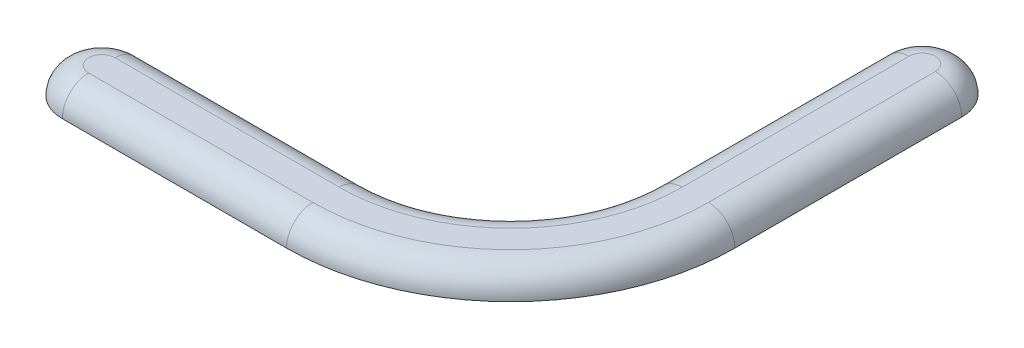
ISO-10303-21;
HEADER;
FILE_DESCRIPTION(('STEP AP214'),'2;1');
FILE_NAME('part.step','',(''),(''),'','','');
FILE_SCHEMA(('AUTOMOTIVE_DESIGN { 1 0 10303 214 1 1 1 1 }'));
ENDSEC;
DATA;
#1=APPLICATION_CONTEXT('core data for automotive mechanical design processes');
#2=APPLICATION_PROTOCOL_DEFINITION('international standard','automotive_design',2000,#1);
#3=PRODUCT_CONTEXT('',#1,'mechanical');
#4=PRODUCT('Part','Part','',(#3));
#5=PRODUCT_RELATED_PRODUCT_CATEGORY('part','',(#4));
#6=PRODUCT_DEFINITION_FORMATION('','',#4);
#7=PRODUCT_DEFINITION_CONTEXT('part definition',#1,'design');
#8=PRODUCT_DEFINITION('design','',#6,#7);
#9=PRODUCT_DEFINITION_SHAPE('','',#8);
#10=(LENGTH_UNIT() NAMED_UNIT(*) SI_UNIT(.MILLI.,.METRE.));
#11=(NAMED_UNIT(*) PLANE_ANGLE_UNIT() SI_UNIT($,.RADIAN.));
#12=(NAMED_UNIT(*) SI_UNIT($,.STERADIAN.) SOLID_ANGLE_UNIT());
#13=UNCERTAINTY_MEASURE_WITH_UNIT(LENGTH_MEASURE(1.E-05),#10,'distance_accuracy_value','');
#14=(GEOMETRIC_REPRESENTATION_CONTEXT(3) GLOBAL_UNCERTAINTY_ASSIGNED_CONTEXT((#13)) GLOBAL_UNIT_ASSIGNED_CONTEXT((#10,
#11,#12)) REPRESENTATION_CONTEXT('',''));
#15=CARTESIAN_POINT('',(0.,0.,0.));
#16=DIRECTION('',(0.,0.,1.));
#17=DIRECTION('',(1.,0.,0.));
#18=AXIS2_PLACEMENT_3D('',#15,#16,#17);
#19=CARTESIAN_POINT('',(37.0063979542959,1.05614812313521,98.896253755));
#20=DIRECTION('',(0.,-1.,0.));
#21=DIRECTION('',(0.,0.,-1.));
#22=AXIS2_PLACEMENT_3D('',#19,#20,#21);
#23=PLANE('',#22);
#24=CARTESIAN_POINT('',(41.2063979542959,1.05614812313521,93.7367562249847));
#25=DIRECTION('',(0.,-1.,0.));
#26=DIRECTION('',(0.,0.,-1.));
#27=AXIS2_PLACEMENT_3D('',#24,#25,#26);
#28=CIRCLE('',#27,0.300000000000002);
#29=CARTESIAN_POINT('',(41.5063979542959,1.05614812313521,93.7367562249847));
#30=VERTEX_POINT('',#29);
#31=CARTESIAN_POINT('',(40.9063979542959,1.05614812313521,93.7367562249847));
#32=VERTEX_POINT('',#31);
#33=EDGE_CURVE('E46',#30,#32,#28,.F.);
#34=ORIENTED_EDGE('',*,*,#33,.T.);
#35=DIRECTION('',(0.,0.,1.));
#36=VECTOR('',#35,1.);
#37=CARTESIAN_POINT('',(40.9063979542959,1.05614812313521,98.896253755));
#38=LINE('',#37,#36);
#39=CARTESIAN_POINT('',(40.9063979542959,1.05614812313521,98.896253755));
#40=VERTEX_POINT('',#39);
#41=EDGE_CURVE('E11',#32,#40,#38,.T.);
#42=ORIENTED_EDGE('',*,*,#41,.T.);
#43=CARTESIAN_POINT('',(37.0063979542959,1.05614812313521,98.896253755));
#44=DIRECTION('',(0.,-1.,0.));
#45=DIRECTION('',(0.,0.,-1.));
#46=AXIS2_PLACEMENT_3D('',#43,#44,#45);
#47=CIRCLE('',#46,3.9);
#48=CARTESIAN_POINT('',(37.0063979542959,1.05614812313521,102.796253755));
#49=VERTEX_POINT('',#48);
#50=EDGE_CURVE('E141',#40,#49,#47,.T.);
#51=ORIENTED_EDGE('',*,*,#50,.T.);
#52=DIRECTION('',(-1.,0.,0.));
#53=VECTOR('',#52,1.);
#54=CARTESIAN_POINT('',(37.0063979542959,1.05614812313521,102.796253755));
#55=LINE('',#54,#53);
#56=CARTESIAN_POINT('',(31.9063979542959,1.05614812313521,102.796253755));
#57=VERTEX_POINT('',#56);
#58=EDGE_CURVE('E146',#49,#57,#55,.T.);
#59=ORIENTED_EDGE('',*,*,#58,.T.);
#60=CARTESIAN_POINT('',(31.9063979542959,1.05614812313521,103.096253755));
#61=DIRECTION('',(0.,-1.,0.));
#62=DIRECTION('',(0.,0.,-1.));
#63=AXIS2_PLACEMENT_3D('',#60,#61,#62);
#64=CIRCLE('',#63,0.299999999999998);
#65=CARTESIAN_POINT('',(31.9063979542959,1.05614812313521,103.396253755));
#66=VERTEX_POINT('',#65);
#67=EDGE_CURVE('E148',#57,#66,#64,.F.);
#68=ORIENTED_EDGE('',*,*,#67,.T.);
#69=DIRECTION('',(1.,0.,0.));
#70=VECTOR('',#69,1.);
#71=CARTESIAN_POINT('',(37.0063979542959,1.05614812313521,103.396253755));
#72=LINE('',#71,#70);
#73=CARTESIAN_POINT('',(37.0063979542959,1.05614812313521,103.396253755));
#74=VERTEX_POINT('',#73);
#75=EDGE_CURVE('E150',#66,#74,#72,.T.);
#76=ORIENTED_EDGE('',*,*,#75,.T.);
#77=CARTESIAN_POINT('',(37.0063979542959,1.05614812313521,98.896253755));
#78=DIRECTION('',(0.,-1.,0.));
#79=DIRECTION('',(0.,0.,-1.));
#80=AXIS2_PLACEMENT_3D('',#77,#78,#79);
#81=CIRCLE('',#80,4.5);
#82=CARTESIAN_POINT('',(41.5063979542959,1.05614812313521,98.896253755));
#83=VERTEX_POINT('',#82);
#84=EDGE_CURVE('E144',#74,#83,#81,.F.);
#85=ORIENTED_EDGE('',*,*,#84,.T.);
#86=DIRECTION('',(0.,0.,-1.));
#87=VECTOR('',#86,1.);
#88=CARTESIAN_POINT('',(41.5063979542959,1.05614812313521,98.896253755));
#89=LINE('',#88,#87);
#90=EDGE_CURVE('E121',#83,#30,#89,.T.);
#91=ORIENTED_EDGE('',*,*,#90,.T.);
#92=EDGE_LOOP('',(#34,#42,#51,#59,#68,#76,#85,#91));
#93=FACE_BOUND('',#92,.T.);
#94=ADVANCED_FACE('F37',(#93),#23,.F.);
#95=CARTESIAN_POINT('',(37.0063979542959,0.456148123135214,98.896253755));
#96=DIRECTION('',(0.,-1.,0.));
#97=DIRECTION('',(0.,0.,-1.));
#98=AXIS2_PLACEMENT_3D('',#95,#96,#97);
#99=PLANE('',#98);
#100=CARTESIAN_POINT('',(37.0063979542959,0.456148123135214,98.896253755));
#101=DIRECTION('',(0.,1.,0.));
#102=DIRECTION('',(0.,0.,-1.));
#103=AXIS2_PLACEMENT_3D('',#100,#101,#102);
#104=CIRCLE('',#103,5.1);
#105=CARTESIAN_POINT('',(37.0063979542959,0.456148123135214,103.996253755));
#106=VERTEX_POINT('',#105);
#107=CARTESIAN_POINT('',(42.1063979542959,0.456148123135214,98.896253755));
#108=VERTEX_POINT('',#107);
#109=EDGE_CURVE('E103',#106,#108,#104,.T.);
#110=ORIENTED_EDGE('',*,*,#109,.F.);
#111=DIRECTION('',(1.,0.,0.));
#112=VECTOR('',#111,1.);
#113=CARTESIAN_POINT('',(31.9063979542959,0.456148123135214,103.996253755));
#114=LINE('',#113,#112);
#115=CARTESIAN_POINT('',(31.9063979542959,0.456148123135214,103.996253755));
#116=VERTEX_POINT('',#115);
#117=EDGE_CURVE('E152',#116,#106,#114,.T.);
#118=ORIENTED_EDGE('',*,*,#117,.F.);
#119=CARTESIAN_POINT('',(31.9063979542959,0.456148123135214,103.096253755));
#120=DIRECTION('',(0.,1.,0.));
#121=DIRECTION('',(0.,0.,-1.));
#122=AXIS2_PLACEMENT_3D('',#119,#120,#121);
#123=CIRCLE('',#122,0.899999999999998);
#124=CARTESIAN_POINT('',(31.9063979542959,0.456148123135214,102.196253755));
#125=VERTEX_POINT('',#124);
#126=EDGE_CURVE('E154',#125,#116,#123,.T.);
#127=ORIENTED_EDGE('',*,*,#126,.F.);
#128=DIRECTION('',(-1.,0.,0.));
#129=VECTOR('',#128,1.);
#130=CARTESIAN_POINT('',(31.9063979542959,0.456148123135214,102.196253755));
#131=LINE('',#130,#129);
#132=CARTESIAN_POINT('',(37.0063979542959,0.456148123135214,102.196253755));
#133=VERTEX_POINT('',#132);
#134=EDGE_CURVE('E157',#133,#125,#131,.T.);
#135=ORIENTED_EDGE('',*,*,#134,.F.);
#136=CARTESIAN_POINT('',(37.0063979542959,0.456148123135214,98.896253755));
#137=DIRECTION('',(0.,-1.,0.));
#138=DIRECTION('',(0.,0.,-1.));
#139=AXIS2_PLACEMENT_3D('',#136,#137,#138);
#140=CIRCLE('',#139,3.3);
#141=CARTESIAN_POINT('',(40.3063979542959,0.456148123135214,98.896253755));
#142=VERTEX_POINT('',#141);
#143=EDGE_CURVE('E160',#142,#133,#140,.T.);
#144=ORIENTED_EDGE('',*,*,#143,.F.);
#145=DIRECTION('',(0.,0.,1.));
#146=VECTOR('',#145,1.);
#147=CARTESIAN_POINT('',(40.3063979542959,0.456148123135214,98.896253755));
#148=LINE('',#147,#146);
#149=CARTESIAN_POINT('',(40.3063979542959,0.456148123135214,93.7367562249847));
#150=VERTEX_POINT('',#149);
#151=EDGE_CURVE('E163',#150,#142,#148,.T.);
#152=ORIENTED_EDGE('',*,*,#151,.F.);
#153=CARTESIAN_POINT('',(41.2063979542959,0.456148123135214,93.7367562249847));
#154=DIRECTION('',(0.,1.,0.));
#155=DIRECTION('',(0.,0.,1.));
#156=AXIS2_PLACEMENT_3D('',#153,#154,#155);
#157=CIRCLE('',#156,0.900000000000001);
#158=CARTESIAN_POINT('',(42.1063979542959,0.456148123135214,93.7367562249847));
#159=VERTEX_POINT('',#158);
#160=EDGE_CURVE('E106',#159,#150,#157,.T.);
#161=ORIENTED_EDGE('',*,*,#160,.F.);
#162=DIRECTION('',(0.,0.,-1.));
#163=VECTOR('',#162,1.);
#164=CARTESIAN_POINT('',(42.1063979542959,0.456148123135214,98.896253755));
#165=LINE('',#164,#163);
#166=EDGE_CURVE('E100',#108,#159,#165,.T.);
#167=ORIENTED_EDGE('',*,*,#166,.F.);
#168=EDGE_LOOP('',(#110,#118,#127,#135,#144,#152,#161,#167));
#169=FACE_BOUND('',#168,.T.);
#170=ADVANCED_FACE('F102',(#169),#99,.T.);
#171=CARTESIAN_POINT('',(37.0063979542959,0.456148123135214,98.896253755));
#172=DIRECTION('',(0.,-1.,0.));
#173=DIRECTION('',(0.,0.,-1.));
#174=AXIS2_PLACEMENT_3D('',#171,#172,#173);
#175=TOROIDAL_SURFACE('',#174,4.5,0.6);
#176=CARTESIAN_POINT('',(37.0063979542959,0.456148123135214,103.396253755));
#177=DIRECTION('',(-1.,0.,0.));
#178=DIRECTION('',(0.,0.,1.));
#179=AXIS2_PLACEMENT_3D('',#176,#177,#178);
#180=CIRCLE('',#179,0.6);
#181=EDGE_CURVE('E117',#106,#74,#180,.T.);
#182=ORIENTED_EDGE('',*,*,#181,.F.);
#183=ORIENTED_EDGE('',*,*,#109,.T.);
#184=CARTESIAN_POINT('',(41.5063979542959,0.456148123135214,98.896253755));
#185=DIRECTION('',(0.,0.,-1.));
#186=DIRECTION('',(-1.,0.,0.));
#187=AXIS2_PLACEMENT_3D('',#184,#185,#186);
#188=CIRCLE('',#187,0.6);
#189=EDGE_CURVE('E41',#83,#108,#188,.T.);
#190=ORIENTED_EDGE('',*,*,#189,.F.);
#191=ORIENTED_EDGE('',*,*,#84,.F.);
#192=EDGE_LOOP('',(#182,#183,#190,#191));
#193=FACE_BOUND('',#192,.T.);
#194=ADVANCED_FACE('F39',(#193),#175,.T.);
#195=CARTESIAN_POINT('',(41.5063979542959,0.456148123135214,98.896253755));
#196=DIRECTION('',(0.,0.,-1.));
#197=DIRECTION('',(-1.,0.,0.));
#198=AXIS2_PLACEMENT_3D('',#195,#196,#197);
#199=CYLINDRICAL_SURFACE('',#198,0.6);
#200=ORIENTED_EDGE('',*,*,#189,.T.);
#201=ORIENTED_EDGE('',*,*,#166,.T.);
#202=CARTESIAN_POINT('',(41.5063979542959,0.456148123135214,93.7367562249847));
#203=DIRECTION('',(0.,0.,-1.));
#204=DIRECTION('',(-1.,0.,0.));
#205=AXIS2_PLACEMENT_3D('',#202,#203,#204);
#206=CIRCLE('',#205,0.6);
#207=EDGE_CURVE('E122',#30,#159,#206,.T.);
#208=ORIENTED_EDGE('',*,*,#207,.F.);
#209=ORIENTED_EDGE('',*,*,#90,.F.);
#210=EDGE_LOOP('',(#200,#201,#208,#209));
#211=FACE_BOUND('',#210,.T.);
#212=ADVANCED_FACE('F120',(#211),#199,.T.);
#213=CARTESIAN_POINT('',(37.0063979542959,0.456148123135214,103.396253755));
#214=DIRECTION('',(1.,0.,0.));
#215=DIRECTION('',(0.,0.,-1.));
#216=AXIS2_PLACEMENT_3D('',#213,#214,#215);
#217=CYLINDRICAL_SURFACE('',#216,0.6);
#218=ORIENTED_EDGE('',*,*,#181,.T.);
#219=ORIENTED_EDGE('',*,*,#75,.F.);
#220=CARTESIAN_POINT('',(31.9063979542959,0.456148123135214,103.396253755));
#221=DIRECTION('',(-1.,0.,0.));
#222=DIRECTION('',(0.,0.,1.));
#223=AXIS2_PLACEMENT_3D('',#220,#221,#222);
#224=CIRCLE('',#223,0.6);
#225=EDGE_CURVE('E125',#116,#66,#224,.T.);
#226=ORIENTED_EDGE('',*,*,#225,.F.);
#227=ORIENTED_EDGE('',*,*,#117,.T.);
#228=EDGE_LOOP('',(#218,#219,#226,#227));
#229=FACE_BOUND('',#228,.T.);
#230=ADVANCED_FACE('F183',(#229),#217,.T.);
#231=CARTESIAN_POINT('',(41.2063979542959,0.456148123135214,93.7367562249847));
#232=DIRECTION('',(0.,-1.,0.));
#233=DIRECTION('',(0.,0.,-1.));
#234=AXIS2_PLACEMENT_3D('',#231,#232,#233);
#235=DEGENERATE_TOROIDAL_SURFACE('',#234,0.300000000000002,0.6,.T.);
#236=ORIENTED_EDGE('',*,*,#207,.T.);
#237=ORIENTED_EDGE('',*,*,#160,.T.);
#238=CARTESIAN_POINT('',(40.9063979542959,0.456148123135214,93.7367562249847));
#239=DIRECTION('',(0.,0.,1.));
#240=DIRECTION('',(1.,0.,0.));
#241=AXIS2_PLACEMENT_3D('',#238,#239,#240);
#242=CIRCLE('',#241,0.6);
#243=EDGE_CURVE('E130',#32,#150,#242,.T.);
#244=ORIENTED_EDGE('',*,*,#243,.F.);
#245=ORIENTED_EDGE('',*,*,#33,.F.);
#246=EDGE_LOOP('',(#236,#237,#244,#245));
#247=FACE_BOUND('',#246,.T.);
#248=ADVANCED_FACE('F167',(#247),#235,.T.);
#249=CARTESIAN_POINT('',(31.9063979542959,0.456148123135214,103.096253755));
#250=DIRECTION('',(0.,-1.,0.));
#251=DIRECTION('',(0.,0.,-1.));
#252=AXIS2_PLACEMENT_3D('',#249,#250,#251);
#253=DEGENERATE_TOROIDAL_SURFACE('',#252,0.299999999999998,0.6,.T.);
#254=ORIENTED_EDGE('',*,*,#225,.T.);
#255=ORIENTED_EDGE('',*,*,#67,.F.);
#256=CARTESIAN_POINT('',(31.9063979542959,0.456148123135214,102.796253755));
#257=DIRECTION('',(1.,0.,0.));
#258=DIRECTION('',(0.,0.,-1.));
#259=AXIS2_PLACEMENT_3D('',#256,#257,#258);
#260=CIRCLE('',#259,0.6);
#261=EDGE_CURVE('E133',#125,#57,#260,.T.);
#262=ORIENTED_EDGE('',*,*,#261,.F.);
#263=ORIENTED_EDGE('',*,*,#126,.T.);
#264=EDGE_LOOP('',(#254,#255,#262,#263));
#265=FACE_BOUND('',#264,.T.);
#266=ADVANCED_FACE('F180',(#265),#253,.T.);
#267=CARTESIAN_POINT('',(40.9063979542959,0.456148123135214,98.896253755));
#268=DIRECTION('',(0.,0.,1.));
#269=DIRECTION('',(1.,0.,0.));
#270=AXIS2_PLACEMENT_3D('',#267,#268,#269);
#271=CYLINDRICAL_SURFACE('',#270,0.6);
#272=ORIENTED_EDGE('',*,*,#243,.T.);
#273=ORIENTED_EDGE('',*,*,#151,.T.);
#274=CARTESIAN_POINT('',(40.9063979542959,0.456148123135214,98.896253755));
#275=DIRECTION('',(0.,0.,1.));
#276=DIRECTION('',(1.,0.,0.));
#277=AXIS2_PLACEMENT_3D('',#274,#275,#276);
#278=CIRCLE('',#277,0.6);
#279=EDGE_CURVE('E136',#40,#142,#278,.T.);
#280=ORIENTED_EDGE('',*,*,#279,.F.);
#281=ORIENTED_EDGE('',*,*,#41,.F.);
#282=EDGE_LOOP('',(#272,#273,#280,#281));
#283=FACE_BOUND('',#282,.T.);
#284=ADVANCED_FACE('F169',(#283),#271,.T.);
#285=CARTESIAN_POINT('',(37.0063979542959,0.456148123135214,102.796253755));
#286=DIRECTION('',(-1.,0.,0.));
#287=DIRECTION('',(0.,0.,1.));
#288=AXIS2_PLACEMENT_3D('',#285,#286,#287);
#289=CYLINDRICAL_SURFACE('',#288,0.6);
#290=ORIENTED_EDGE('',*,*,#261,.T.);
#291=ORIENTED_EDGE('',*,*,#58,.F.);
#292=CARTESIAN_POINT('',(37.0063979542959,0.456148123135214,102.796253755));
#293=DIRECTION('',(1.,0.,0.));
#294=DIRECTION('',(0.,0.,-1.));
#295=AXIS2_PLACEMENT_3D('',#292,#293,#294);
#296=CIRCLE('',#295,0.6);
#297=EDGE_CURVE('E138',#133,#49,#296,.T.);
#298=ORIENTED_EDGE('',*,*,#297,.F.);
#299=ORIENTED_EDGE('',*,*,#134,.T.);
#300=EDGE_LOOP('',(#290,#291,#298,#299));
#301=FACE_BOUND('',#300,.T.);
#302=ADVANCED_FACE('F182',(#301),#289,.T.);
#303=CARTESIAN_POINT('',(37.0063979542959,0.456148123135214,98.896253755));
#304=DIRECTION('',(0.,-1.,0.));
#305=DIRECTION('',(0.,0.,-1.));
#306=AXIS2_PLACEMENT_3D('',#303,#304,#305);
#307=TOROIDAL_SURFACE('',#306,3.9,0.6);
#308=ORIENTED_EDGE('',*,*,#279,.T.);
#309=ORIENTED_EDGE('',*,*,#143,.T.);
#310=ORIENTED_EDGE('',*,*,#297,.T.);
#311=ORIENTED_EDGE('',*,*,#50,.F.);
#312=EDGE_LOOP('',(#308,#309,#310,#311));
#313=FACE_BOUND('',#312,.T.);
#314=ADVANCED_FACE('F173',(#313),#307,.T.);
#315=CLOSED_SHELL('',(#94,#170,#194,#212,#230,#248,#266,#284,#302,#314));
#316=MANIFOLD_SOLID_BREP('B2',#315);
#317=ADVANCED_BREP_SHAPE_REPRESENTATION('',(#18,#316),#14);
#318=SHAPE_DEFINITION_REPRESENTATION(#9,#317);
ENDSEC;
END-ISO-10303-21;
